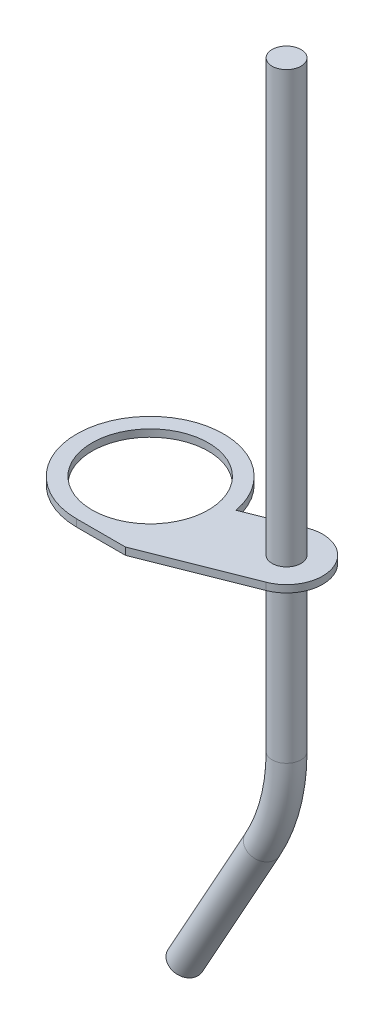
ISO-10303-21;
HEADER;
FILE_DESCRIPTION(('STEP AP214'),'2;1');
FILE_NAME('part.step','',(''),(''),'','','');
FILE_SCHEMA(('AUTOMOTIVE_DESIGN { 1 0 10303 214 1 1 1 1 }'));
ENDSEC;
DATA;
#1=APPLICATION_CONTEXT('core data for automotive mechanical design processes');
#2=APPLICATION_PROTOCOL_DEFINITION('international standard','automotive_design',2000,#1);
#3=PRODUCT_CONTEXT('',#1,'mechanical');
#4=PRODUCT('Part','Part','',(#3));
#5=PRODUCT_RELATED_PRODUCT_CATEGORY('part','',(#4));
#6=PRODUCT_DEFINITION_FORMATION('','',#4);
#7=PRODUCT_DEFINITION_CONTEXT('part definition',#1,'design');
#8=PRODUCT_DEFINITION('design','',#6,#7);
#9=PRODUCT_DEFINITION_SHAPE('','',#8);
#10=(LENGTH_UNIT() NAMED_UNIT(*) SI_UNIT(.MILLI.,.METRE.));
#11=(NAMED_UNIT(*) PLANE_ANGLE_UNIT() SI_UNIT($,.RADIAN.));
#12=(NAMED_UNIT(*) SI_UNIT($,.STERADIAN.) SOLID_ANGLE_UNIT());
#13=UNCERTAINTY_MEASURE_WITH_UNIT(LENGTH_MEASURE(1.E-05),#10,'distance_accuracy_value','');
#14=(GEOMETRIC_REPRESENTATION_CONTEXT(3) GLOBAL_UNCERTAINTY_ASSIGNED_CONTEXT((#13)) GLOBAL_UNIT_ASSIGNED_CONTEXT((#10,
#11,#12)) REPRESENTATION_CONTEXT('',''));
#15=CARTESIAN_POINT('',(0.,0.,0.));
#16=DIRECTION('',(0.,0.,1.));
#17=DIRECTION('',(1.,0.,0.));
#18=AXIS2_PLACEMENT_3D('',#15,#16,#17);
#19=CARTESIAN_POINT('',(0.,0.,0.));
#20=DIRECTION('',(0.,-1.,0.));
#21=DIRECTION('',(0.,0.,-1.));
#22=AXIS2_PLACEMENT_3D('',#19,#20,#21);
#23=CYLINDRICAL_SURFACE('',#22,2.);
#24=CARTESIAN_POINT('',(0.,-83.,0.));
#25=DIRECTION('',(0.,1.,0.));
#26=DIRECTION('',(0.,0.,1.));
#27=AXIS2_PLACEMENT_3D('',#24,#25,#26);
#28=CIRCLE('',#27,2.);
#29=CARTESIAN_POINT('',(1.99999999999992,-83.,0.));
#30=VERTEX_POINT('',#29);
#31=EDGE_CURVE('E150',#30,#30,#28,.T.);
#32=ORIENTED_EDGE('',*,*,#31,.T.);
#33=EDGE_LOOP('',(#32));
#34=FACE_BOUND('',#33,.T.);
#35=CARTESIAN_POINT('',(0.,-60.5,0.));
#36=DIRECTION('',(0.,1.,0.));
#37=DIRECTION('',(0.,0.,1.));
#38=AXIS2_PLACEMENT_3D('',#35,#36,#37);
#39=CIRCLE('',#38,2.);
#40=CARTESIAN_POINT('',(0.,-60.5,2.));
#41=VERTEX_POINT('',#40);
#42=EDGE_CURVE('E11',#41,#41,#39,.T.);
#43=ORIENTED_EDGE('',*,*,#42,.F.);
#44=EDGE_LOOP('',(#43));
#45=FACE_BOUND('',#44,.T.);
#46=ADVANCED_FACE('F39',(#34,#45),#23,.T.);
#47=CARTESIAN_POINT('',(-14.,-115.,0.));
#48=DIRECTION('',(0.485861182519272,0.874035989717228,0.));
#49=DIRECTION('',(0.,0.,1.));
#50=AXIS2_PLACEMENT_3D('',#47,#48,#49);
#51=PLANE('',#50);
#52=CARTESIAN_POINT('',(-14.,-115.,0.));
#53=DIRECTION('',(0.485861182519272,0.874035989717228,0.));
#54=DIRECTION('',(0.,0.,1.));
#55=AXIS2_PLACEMENT_3D('',#52,#53,#54);
#56=CIRCLE('',#55,2.);
#57=CARTESIAN_POINT('',(-12.2519280205655,-115.971722365039,0.));
#58=VERTEX_POINT('',#57);
#59=EDGE_CURVE('E50',#58,#58,#56,.T.);
#60=ORIENTED_EDGE('',*,*,#59,.F.);
#61=EDGE_LOOP('',(#60));
#62=FACE_BOUND('',#61,.T.);
#63=ADVANCED_FACE('F165',(#62),#51,.F.);
#64=CARTESIAN_POINT('',(-26.2857142857141,-83.,0.));
#65=DIRECTION('',(0.,0.,-1.));
#66=DIRECTION('',(-1.,0.,0.));
#67=AXIS2_PLACEMENT_3D('',#64,#65,#66);
#68=TOROIDAL_SURFACE('',#67,26.285714285714,2.);
#69=CARTESIAN_POINT('',(-3.3110539845759,-95.771208226221,0.));
#70=DIRECTION('',(0.485861182519281,0.874035989717223,0.));
#71=DIRECTION('',(0.,0.,1.));
#72=AXIS2_PLACEMENT_3D('',#69,#70,#71);
#73=CIRCLE('',#72,2.);
#74=CARTESIAN_POINT('',(-1.56298200514146,-96.7429305912596,0.));
#75=VERTEX_POINT('',#74);
#76=EDGE_CURVE('E154',#75,#75,#73,.T.);
#77=CARTESIAN_POINT('',(-26.2857142857141,-83.,0.));
#78=DIRECTION('',(0.,0.,-1.));
#79=DIRECTION('',(-1.,0.,0.));
#80=AXIS2_PLACEMENT_3D('',#77,#78,#79);
#81=CIRCLE('',#80,28.285714285714);
#82=EDGE_CURVE('',#30,#75,#81,.T.);
#83=ORIENTED_EDGE('',*,*,#31,.F.);
#84=ORIENTED_EDGE('',*,*,#76,.T.);
#85=ORIENTED_EDGE('',*,*,#82,.T.);
#86=ORIENTED_EDGE('',*,*,#82,.F.);
#87=EDGE_LOOP('',(#83,#85,#84,#86));
#88=FACE_BOUND('',#87,.T.);
#89=ADVANCED_FACE('F167',(#88),#68,.T.);
#90=CARTESIAN_POINT('',(-3.31105398457598,-95.7712082262209,0.));
#91=DIRECTION('',(-0.485861182519272,-0.874035989717228,0.));
#92=DIRECTION('',(0.874035989717228,-0.485861182519272,0.));
#93=AXIS2_PLACEMENT_3D('',#90,#91,#92);
#94=CYLINDRICAL_SURFACE('',#93,2.);
#95=CARTESIAN_POINT('',(-12.2519280205655,-115.971722365039,0.));
#96=CARTESIAN_POINT('',(-12.1405848329048,-115.771422450728,0.));
#97=CARTESIAN_POINT('',(-12.0292416452442,-115.571122536418,0.));
#98=CARTESIAN_POINT('',(-11.8065552699229,-115.170522707798,0.));
#99=CARTESIAN_POINT('',(-11.6952120822622,-114.970222793488,0.));
#100=CARTESIAN_POINT('',(-11.4725257069409,-114.569622964867,0.));
#101=CARTESIAN_POINT('',(-11.3611825192802,-114.369323050557,0.));
#102=CARTESIAN_POINT('',(-11.1384961439589,-113.968723221937,0.));
#103=CARTESIAN_POINT('',(-11.0271529562982,-113.768423307626,0.));
#104=CARTESIAN_POINT('',(-10.8044665809769,-113.367823479006,0.));
#105=CARTESIAN_POINT('',(-10.6931233933162,-113.167523564696,0.));
#106=CARTESIAN_POINT('',(-10.4704370179949,-112.766923736075,0.));
#107=CARTESIAN_POINT('',(-10.3590938303342,-112.566623821765,0.));
#108=CARTESIAN_POINT('',(-10.1364074550129,-112.166023993145,0.));
#109=CARTESIAN_POINT('',(-10.0250642673522,-111.965724078835,0.));
#110=CARTESIAN_POINT('',(-9.80237789203086,-111.565124250214,0.));
#111=CARTESIAN_POINT('',(-9.69103470437019,-111.364824335904,0.));
#112=CARTESIAN_POINT('',(-9.46834832904886,-110.964224507284,0.));
#113=CARTESIAN_POINT('',(-9.35700514138819,-110.763924592973,0.));
#114=CARTESIAN_POINT('',(-9.13431876606686,-110.363324764353,0.));
#115=CARTESIAN_POINT('',(-9.02297557840619,-110.163024850043,0.));
#116=CARTESIAN_POINT('',(-8.80028920308486,-109.762425021422,0.));
#117=CARTESIAN_POINT('',(-8.68894601542419,-109.562125107112,0.));
#118=CARTESIAN_POINT('',(-8.46625964010286,-109.161525278492,0.));
#119=CARTESIAN_POINT('',(-8.35491645244219,-108.961225364182,0.));
#120=CARTESIAN_POINT('',(-8.13223007712086,-108.560625535561,0.));
#121=CARTESIAN_POINT('',(-8.02088688946019,-108.360325621251,0.));
#122=CARTESIAN_POINT('',(-7.79820051413886,-107.959725792631,0.));
#123=CARTESIAN_POINT('',(-7.68685732647819,-107.75942587832,0.));
#124=CARTESIAN_POINT('',(-7.46417095115686,-107.3588260497,0.));
#125=CARTESIAN_POINT('',(-7.35282776349619,-107.15852613539,0.));
#126=CARTESIAN_POINT('',(-7.13014138817486,-106.757926306769,0.));
#127=CARTESIAN_POINT('',(-7.01879820051419,-106.557626392459,0.));
#128=CARTESIAN_POINT('',(-6.79611182519286,-106.157026563839,0.));
#129=CARTESIAN_POINT('',(-6.68476863753219,-105.956726649529,0.));
#130=CARTESIAN_POINT('',(-6.46208226221086,-105.556126820908,0.));
#131=CARTESIAN_POINT('',(-6.35073907455019,-105.355826906598,0.));
#132=CARTESIAN_POINT('',(-6.12805269922886,-104.955227077978,0.));
#133=CARTESIAN_POINT('',(-6.01670951156819,-104.754927163667,0.));
#134=CARTESIAN_POINT('',(-5.79402313624686,-104.354327335047,0.));
#135=CARTESIAN_POINT('',(-5.68267994858619,-104.154027420737,0.));
#136=CARTESIAN_POINT('',(-5.45999357326486,-103.753427592116,0.));
#137=CARTESIAN_POINT('',(-5.34865038560419,-103.553127677806,0.));
#138=CARTESIAN_POINT('',(-5.12596401028286,-103.152527849186,0.));
#139=CARTESIAN_POINT('',(-5.0146208226222,-102.952227934876,0.));
#140=CARTESIAN_POINT('',(-4.79193444730086,-102.551628106255,0.));
#141=CARTESIAN_POINT('',(-4.68059125964019,-102.351328191945,0.));
#142=CARTESIAN_POINT('',(-4.45790488431886,-101.950728363325,0.));
#143=CARTESIAN_POINT('',(-4.3465616966582,-101.750428449014,0.));
#144=CARTESIAN_POINT('',(-4.12387532133686,-101.349828620394,0.));
#145=CARTESIAN_POINT('',(-4.0125321336762,-101.149528706084,0.));
#146=CARTESIAN_POINT('',(-3.78984575835486,-100.748928877463,0.));
#147=CARTESIAN_POINT('',(-3.6785025706942,-100.548628963153,0.));
#148=CARTESIAN_POINT('',(-3.45581619537286,-100.148029134533,0.));
#149=CARTESIAN_POINT('',(-3.3444730077122,-99.9477292202227,0.));
#150=CARTESIAN_POINT('',(-3.12178663239086,-99.5471293916023,0.));
#151=CARTESIAN_POINT('',(-3.0104434447302,-99.3468294772921,0.));
#152=CARTESIAN_POINT('',(-2.78775706940886,-98.9462296486717,0.));
#153=CARTESIAN_POINT('',(-2.6764138817482,-98.7459297343615,0.));
#154=CARTESIAN_POINT('',(-2.45372750642687,-98.3453299057411,0.));
#155=CARTESIAN_POINT('',(-2.3423843187662,-98.1450299914309,0.));
#156=CARTESIAN_POINT('',(-2.11969794344486,-97.7444301628105,0.));
#157=CARTESIAN_POINT('',(-2.0083547557842,-97.5441302485003,0.));
#158=CARTESIAN_POINT('',(-1.78566838046287,-97.1435304198799,0.));
#159=CARTESIAN_POINT('',(-1.6743251928022,-96.9432305055697,0.));
#160=CARTESIAN_POINT('',(-1.56298200514153,-96.7429305912595,0.));
#161=B_SPLINE_CURVE_WITH_KNOTS('',3,(#95,#96,#97,#98,#99,#100,#101,#102,#103,#104,#105,#106,
#107,#108,#109,#110,#111,#112,#113,#114,#115,#116,#117,#118,#119,#120,#121,#122,#123,#124,#125,
#126,#127,#128,#129,#130,#131,#132,#133,#134,#135,#136,#137,#138,#139,#140,#141,#142,#143,#144,
#145,#146,#147,#148,#149,#150,#151,#152,#153,#154,#155,#156,#157,#158,#159,#160),.UNSPECIFIED.,
.F.,.F.,(4,2,2,2,2,2,2,2,2,2,2,2,2,2,2,2,2,2,2,2,2,2,2,2,2,2,2,2,2,2,2,2,4),(0.,0.6875,
1.37500000000001,2.0625,2.75,3.4375,4.125,4.8125,5.5,6.1875,6.875,7.5625,8.25,8.9375,9.625,
10.3125,11.,11.6875,12.375,13.0625,13.75,14.4375,15.125,15.8125,16.5,17.1875,17.875,18.5625,
19.25,19.9375,20.625,21.3125,22.),.UNSPECIFIED.);
#162=EDGE_CURVE('BSEAM162',#58,#75,#161,.T.);
#163=ORIENTED_EDGE('',*,*,#59,.T.);
#164=ORIENTED_EDGE('',*,*,#76,.F.);
#165=ORIENTED_EDGE('',*,*,#162,.T.);
#166=ORIENTED_EDGE('',*,*,#162,.F.);
#167=EDGE_LOOP('',(#163,#165,#164,#166));
#168=FACE_BOUND('',#167,.T.);
#169=ADVANCED_FACE('F162',(#168),#94,.T.);
#170=CARTESIAN_POINT('',(-18.84,-59.5,0.));
#171=DIRECTION('',(0.,-1.,0.));
#172=DIRECTION('',(0.,0.,-1.));
#173=AXIS2_PLACEMENT_3D('',#170,#171,#172);
#174=CYLINDRICAL_SURFACE('',#173,10.16);
#175=CARTESIAN_POINT('',(-18.84,-60.5,0.));
#176=DIRECTION('',(0.,1.,0.));
#177=DIRECTION('',(0.,0.,1.));
#178=AXIS2_PLACEMENT_3D('',#175,#176,#177);
#179=CIRCLE('',#178,10.16);
#180=CARTESIAN_POINT('',(-8.85522732698889,-60.5,-1.87880671392526));
#181=VERTEX_POINT('',#180);
#182=CARTESIAN_POINT('',(-18.84,-60.5,10.16));
#183=VERTEX_POINT('',#182);
#184=EDGE_CURVE('E122',#181,#183,#179,.T.);
#185=ORIENTED_EDGE('',*,*,#184,.T.);
#186=DIRECTION('',(0.,-1.,0.));
#187=VECTOR('',#186,1.);
#188=CARTESIAN_POINT('',(-18.84,-59.5,10.16));
#189=LINE('',#188,#187);
#190=CARTESIAN_POINT('',(-18.84,-59.5,10.16));
#191=VERTEX_POINT('',#190);
#192=EDGE_CURVE('E143',#191,#183,#189,.T.);
#193=ORIENTED_EDGE('',*,*,#192,.F.);
#194=CARTESIAN_POINT('',(-18.84,-59.5,0.));
#195=DIRECTION('',(0.,1.,0.));
#196=DIRECTION('',(0.,0.,1.));
#197=AXIS2_PLACEMENT_3D('',#194,#195,#196);
#198=CIRCLE('',#197,10.16);
#199=CARTESIAN_POINT('',(-8.85522732698889,-59.5,-1.87880671392526));
#200=VERTEX_POINT('',#199);
#201=EDGE_CURVE('E136',#200,#191,#198,.T.);
#202=ORIENTED_EDGE('',*,*,#201,.F.);
#203=DIRECTION('',(0.,-1.,0.));
#204=VECTOR('',#203,1.);
#205=CARTESIAN_POINT('',(-8.85522732698889,-59.5,-1.87880671392526));
#206=LINE('',#205,#204);
#207=EDGE_CURVE('E118',#200,#181,#206,.T.);
#208=ORIENTED_EDGE('',*,*,#207,.T.);
#209=EDGE_LOOP('',(#185,#193,#202,#208));
#210=FACE_BOUND('',#209,.T.);
#211=ADVANCED_FACE('F168',(#210),#174,.T.);
#212=CARTESIAN_POINT('',(-18.84,-59.5,10.16));
#213=DIRECTION('',(0.,0.,-1.));
#214=DIRECTION('',(-1.,0.,0.));
#215=AXIS2_PLACEMENT_3D('',#212,#213,#214);
#216=PLANE('',#215);
#217=DIRECTION('',(1.,0.,0.));
#218=VECTOR('',#217,1.);
#219=CARTESIAN_POINT('',(-18.84,-60.5,10.16));
#220=LINE('',#219,#218);
#221=CARTESIAN_POINT('',(-12.1150484935059,-60.5,10.16));
#222=VERTEX_POINT('',#221);
#223=EDGE_CURVE('E126',#183,#222,#220,.T.);
#224=ORIENTED_EDGE('',*,*,#223,.T.);
#225=DIRECTION('',(0.,-1.,0.));
#226=VECTOR('',#225,1.);
#227=CARTESIAN_POINT('',(-12.1150484935059,-59.5,10.16));
#228=LINE('',#227,#226);
#229=CARTESIAN_POINT('',(-12.1150484935059,-59.5,10.16));
#230=VERTEX_POINT('',#229);
#231=EDGE_CURVE('E111',#230,#222,#228,.T.);
#232=ORIENTED_EDGE('',*,*,#231,.F.);
#233=DIRECTION('',(1.,0.,0.));
#234=VECTOR('',#233,1.);
#235=CARTESIAN_POINT('',(-18.84,-59.5,10.16));
#236=LINE('',#235,#234);
#237=EDGE_CURVE('E93',#191,#230,#236,.T.);
#238=ORIENTED_EDGE('',*,*,#237,.F.);
#239=ORIENTED_EDGE('',*,*,#192,.T.);
#240=EDGE_LOOP('',(#224,#232,#238,#239));
#241=FACE_BOUND('',#240,.T.);
#242=ADVANCED_FACE('F182',(#241),#216,.F.);
#243=CARTESIAN_POINT('',(-12.1150484935059,-59.5,10.16));
#244=DIRECTION('',(-0.367299030129882,0.,-0.930102909610355));
#245=DIRECTION('',(-0.930102909610355,0.,0.367299030129882));
#246=AXIS2_PLACEMENT_3D('',#243,#244,#245);
#247=PLANE('',#246);
#248=DIRECTION('',(0.930102909610355,0.,-0.367299030129882));
#249=VECTOR('',#248,1.);
#250=CARTESIAN_POINT('',(-12.1150484935059,-60.5,10.16));
#251=LINE('',#250,#249);
#252=CARTESIAN_POINT('',(1.83649515064941,-60.5,4.65051454805177));
#253=VERTEX_POINT('',#252);
#254=EDGE_CURVE('E109',#222,#253,#251,.T.);
#255=ORIENTED_EDGE('',*,*,#254,.T.);
#256=DIRECTION('',(0.,-1.,0.));
#257=VECTOR('',#256,1.);
#258=CARTESIAN_POINT('',(1.83649515064941,-59.5,4.65051454805177));
#259=LINE('',#258,#257);
#260=CARTESIAN_POINT('',(1.83649515064941,-59.5,4.65051454805177));
#261=VERTEX_POINT('',#260);
#262=EDGE_CURVE('E106',#261,#253,#259,.T.);
#263=ORIENTED_EDGE('',*,*,#262,.F.);
#264=DIRECTION('',(0.930102909610355,0.,-0.367299030129882));
#265=VECTOR('',#264,1.);
#266=CARTESIAN_POINT('',(-12.1150484935059,-59.5,10.16));
#267=LINE('',#266,#265);
#268=EDGE_CURVE('E97',#230,#261,#267,.T.);
#269=ORIENTED_EDGE('',*,*,#268,.F.);
#270=ORIENTED_EDGE('',*,*,#231,.T.);
#271=EDGE_LOOP('',(#255,#263,#269,#270));
#272=FACE_BOUND('',#271,.T.);
#273=ADVANCED_FACE('F107',(#272),#247,.F.);
#274=CARTESIAN_POINT('',(0.,-59.5,0.));
#275=DIRECTION('',(0.,-1.,0.));
#276=DIRECTION('',(0.,0.,-1.));
#277=AXIS2_PLACEMENT_3D('',#274,#275,#276);
#278=CYLINDRICAL_SURFACE('',#277,5.);
#279=CARTESIAN_POINT('',(0.,-60.5,0.));
#280=DIRECTION('',(0.,1.,0.));
#281=DIRECTION('',(0.,0.,1.));
#282=AXIS2_PLACEMENT_3D('',#279,#280,#281);
#283=CIRCLE('',#282,5.);
#284=CARTESIAN_POINT('',(-1.83649515064941,-60.5,-4.65051454805178));
#285=VERTEX_POINT('',#284);
#286=EDGE_CURVE('E78',#253,#285,#283,.T.);
#287=ORIENTED_EDGE('',*,*,#286,.T.);
#288=DIRECTION('',(0.,-1.,0.));
#289=VECTOR('',#288,1.);
#290=CARTESIAN_POINT('',(-1.83649515064941,-59.5,-4.65051454805178));
#291=LINE('',#290,#289);
#292=CARTESIAN_POINT('',(-1.83649515064941,-59.5,-4.65051454805178));
#293=VERTEX_POINT('',#292);
#294=EDGE_CURVE('E112',#293,#285,#291,.T.);
#295=ORIENTED_EDGE('',*,*,#294,.F.);
#296=CARTESIAN_POINT('',(0.,-59.5,0.));
#297=DIRECTION('',(0.,1.,0.));
#298=DIRECTION('',(0.,0.,1.));
#299=AXIS2_PLACEMENT_3D('',#296,#297,#298);
#300=CIRCLE('',#299,5.);
#301=EDGE_CURVE('E101',#261,#293,#300,.T.);
#302=ORIENTED_EDGE('',*,*,#301,.F.);
#303=ORIENTED_EDGE('',*,*,#262,.T.);
#304=EDGE_LOOP('',(#287,#295,#302,#303));
#305=FACE_BOUND('',#304,.T.);
#306=ADVANCED_FACE('F114',(#305),#278,.T.);
#307=CARTESIAN_POINT('',(-1.83649515064941,-59.5,-4.65051454805178));
#308=DIRECTION('',(0.367299030129882,0.,0.930102909610355));
#309=DIRECTION('',(0.930102909610355,0.,-0.367299030129882));
#310=AXIS2_PLACEMENT_3D('',#307,#308,#309);
#311=PLANE('',#310);
#312=DIRECTION('',(-0.930102909610355,0.,0.367299030129882));
#313=VECTOR('',#312,1.);
#314=CARTESIAN_POINT('',(-1.83649515064941,-60.5,-4.65051454805178));
#315=LINE('',#314,#313);
#316=EDGE_CURVE('E84',#285,#181,#315,.T.);
#317=ORIENTED_EDGE('',*,*,#316,.T.);
#318=ORIENTED_EDGE('',*,*,#207,.F.);
#319=DIRECTION('',(-0.930102909610355,0.,0.367299030129882));
#320=VECTOR('',#319,1.);
#321=CARTESIAN_POINT('',(-1.83649515064941,-59.5,-4.65051454805178));
#322=LINE('',#321,#320);
#323=EDGE_CURVE('E58',#293,#200,#322,.T.);
#324=ORIENTED_EDGE('',*,*,#323,.F.);
#325=ORIENTED_EDGE('',*,*,#294,.T.);
#326=EDGE_LOOP('',(#317,#318,#324,#325));
#327=FACE_BOUND('',#326,.T.);
#328=ADVANCED_FACE('F210',(#327),#311,.F.);
#329=CARTESIAN_POINT('',(-18.84,-59.5,0.));
#330=DIRECTION('',(0.,1.,0.));
#331=DIRECTION('',(0.,0.,1.));
#332=AXIS2_PLACEMENT_3D('',#329,#330,#331);
#333=PLANE('',#332);
#334=CARTESIAN_POINT('',(-18.84,-59.5,0.));
#335=DIRECTION('',(0.,1.,0.));
#336=DIRECTION('',(0.,0.,1.));
#337=AXIS2_PLACEMENT_3D('',#334,#335,#336);
#338=CIRCLE('',#337,8.04);
#339=CARTESIAN_POINT('',(-18.84,-59.5,8.04));
#340=VERTEX_POINT('',#339);
#341=EDGE_CURVE('E298',#340,#340,#338,.T.);
#342=ORIENTED_EDGE('',*,*,#341,.F.);
#343=EDGE_LOOP('',(#342));
#344=FACE_BOUND('',#343,.T.);
#345=CARTESIAN_POINT('',(0.,-59.5,0.));
#346=DIRECTION('',(0.,1.,0.));
#347=DIRECTION('',(0.,0.,1.));
#348=AXIS2_PLACEMENT_3D('',#345,#346,#347);
#349=CIRCLE('',#348,2.);
#350=CARTESIAN_POINT('',(0.,-59.5,2.));
#351=VERTEX_POINT('',#350);
#352=EDGE_CURVE('E43',#351,#351,#349,.T.);
#353=ORIENTED_EDGE('',*,*,#352,.F.);
#354=EDGE_LOOP('',(#353));
#355=FACE_BOUND('',#354,.T.);
#356=ORIENTED_EDGE('',*,*,#201,.T.);
#357=ORIENTED_EDGE('',*,*,#237,.T.);
#358=ORIENTED_EDGE('',*,*,#268,.T.);
#359=ORIENTED_EDGE('',*,*,#301,.T.);
#360=ORIENTED_EDGE('',*,*,#323,.T.);
#361=EDGE_LOOP('',(#356,#357,#358,#359,#360));
#362=FACE_BOUND('',#361,.T.);
#363=ADVANCED_FACE('F99',(#344,#355,#362),#333,.T.);
#364=CARTESIAN_POINT('',(-18.84,-60.5,0.));
#365=DIRECTION('',(0.,1.,0.));
#366=DIRECTION('',(0.,0.,1.));
#367=AXIS2_PLACEMENT_3D('',#364,#365,#366);
#368=PLANE('',#367);
#369=CARTESIAN_POINT('',(-18.84,-60.5,0.));
#370=DIRECTION('',(0.,1.,0.));
#371=DIRECTION('',(0.,0.,1.));
#372=AXIS2_PLACEMENT_3D('',#369,#370,#371);
#373=CIRCLE('',#372,8.04);
#374=CARTESIAN_POINT('',(-18.84,-60.5,8.04));
#375=VERTEX_POINT('',#374);
#376=EDGE_CURVE('E127',#375,#375,#373,.F.);
#377=ORIENTED_EDGE('',*,*,#376,.F.);
#378=EDGE_LOOP('',(#377));
#379=FACE_BOUND('',#378,.T.);
#380=ORIENTED_EDGE('',*,*,#42,.T.);
#381=EDGE_LOOP('',(#380));
#382=FACE_BOUND('',#381,.T.);
#383=ORIENTED_EDGE('',*,*,#184,.F.);
#384=ORIENTED_EDGE('',*,*,#316,.F.);
#385=ORIENTED_EDGE('',*,*,#286,.F.);
#386=ORIENTED_EDGE('',*,*,#254,.F.);
#387=ORIENTED_EDGE('',*,*,#223,.F.);
#388=EDGE_LOOP('',(#383,#384,#385,#386,#387));
#389=FACE_BOUND('',#388,.T.);
#390=ADVANCED_FACE('F201',(#379,#382,#389),#368,.F.);
#391=CARTESIAN_POINT('',(0.,0.,0.));
#392=DIRECTION('',(0.,1.,0.));
#393=DIRECTION('',(0.,0.,1.));
#394=AXIS2_PLACEMENT_3D('',#391,#392,#393);
#395=PLANE('',#394);
#396=CARTESIAN_POINT('',(0.,0.,0.));
#397=DIRECTION('',(0.,1.,0.));
#398=DIRECTION('',(0.,0.,1.));
#399=AXIS2_PLACEMENT_3D('',#396,#397,#398);
#400=CIRCLE('',#399,2.);
#401=CARTESIAN_POINT('',(0.,0.,2.));
#402=VERTEX_POINT('',#401);
#403=EDGE_CURVE('E146',#402,#402,#400,.T.);
#404=ORIENTED_EDGE('',*,*,#403,.T.);
#405=EDGE_LOOP('',(#404));
#406=FACE_BOUND('',#405,.T.);
#407=ADVANCED_FACE('F41',(#406),#395,.T.);
#408=ORIENTED_EDGE('',*,*,#352,.T.);
#409=EDGE_LOOP('',(#408));
#410=FACE_BOUND('',#409,.T.);
#411=ORIENTED_EDGE('',*,*,#403,.F.);
#412=EDGE_LOOP('',(#411));
#413=FACE_BOUND('',#412,.T.);
#414=ADVANCED_FACE('F179',(#410,#413),#23,.T.);
#415=CARTESIAN_POINT('',(-18.84,-115.972722365039,0.));
#416=DIRECTION('',(0.,1.,0.));
#417=DIRECTION('',(0.,0.,1.));
#418=AXIS2_PLACEMENT_3D('',#415,#416,#417);
#419=CYLINDRICAL_SURFACE('',#418,8.04);
#420=CARTESIAN_POINT('',(-18.84,-59.5,8.04));
#421=CARTESIAN_POINT('',(-18.84,-59.5104166666667,8.04));
#422=CARTESIAN_POINT('',(-18.84,-59.5208333333333,8.04));
#423=CARTESIAN_POINT('',(-18.84,-59.5416666666667,8.04));
#424=CARTESIAN_POINT('',(-18.84,-59.5520833333333,8.04));
#425=CARTESIAN_POINT('',(-18.84,-59.5729166666667,8.04));
#426=CARTESIAN_POINT('',(-18.84,-59.5833333333333,8.04));
#427=CARTESIAN_POINT('',(-18.84,-59.6041666666667,8.04));
#428=CARTESIAN_POINT('',(-18.84,-59.6145833333333,8.04));
#429=CARTESIAN_POINT('',(-18.84,-59.6354166666667,8.04));
#430=CARTESIAN_POINT('',(-18.84,-59.6458333333333,8.04));
#431=CARTESIAN_POINT('',(-18.84,-59.6666666666667,8.04));
#432=CARTESIAN_POINT('',(-18.84,-59.6770833333333,8.04));
#433=CARTESIAN_POINT('',(-18.84,-59.6979166666667,8.04));
#434=CARTESIAN_POINT('',(-18.84,-59.7083333333333,8.04));
#435=CARTESIAN_POINT('',(-18.84,-59.7291666666667,8.04));
#436=CARTESIAN_POINT('',(-18.84,-59.7395833333333,8.04));
#437=CARTESIAN_POINT('',(-18.84,-59.7604166666667,8.04));
#438=CARTESIAN_POINT('',(-18.84,-59.7708333333333,8.04));
#439=CARTESIAN_POINT('',(-18.84,-59.7916666666667,8.04));
#440=CARTESIAN_POINT('',(-18.84,-59.8020833333333,8.04));
#441=CARTESIAN_POINT('',(-18.84,-59.8229166666667,8.04));
#442=CARTESIAN_POINT('',(-18.84,-59.8333333333333,8.04));
#443=CARTESIAN_POINT('',(-18.84,-59.8541666666667,8.04));
#444=CARTESIAN_POINT('',(-18.84,-59.8645833333333,8.04));
#445=CARTESIAN_POINT('',(-18.84,-59.8854166666667,8.04));
#446=CARTESIAN_POINT('',(-18.84,-59.8958333333333,8.04));
#447=CARTESIAN_POINT('',(-18.84,-59.9166666666667,8.04));
#448=CARTESIAN_POINT('',(-18.84,-59.9270833333333,8.04));
#449=CARTESIAN_POINT('',(-18.84,-59.9479166666667,8.04));
#450=CARTESIAN_POINT('',(-18.84,-59.9583333333333,8.04));
#451=CARTESIAN_POINT('',(-18.84,-59.9791666666667,8.04));
#452=CARTESIAN_POINT('',(-18.84,-59.9895833333333,8.04));
#453=CARTESIAN_POINT('',(-18.84,-60.0104166666667,8.04));
#454=CARTESIAN_POINT('',(-18.84,-60.0208333333333,8.04));
#455=CARTESIAN_POINT('',(-18.84,-60.0416666666667,8.04));
#456=CARTESIAN_POINT('',(-18.84,-60.0520833333333,8.04));
#457=CARTESIAN_POINT('',(-18.84,-60.0729166666667,8.04));
#458=CARTESIAN_POINT('',(-18.84,-60.0833333333333,8.04));
#459=CARTESIAN_POINT('',(-18.84,-60.1041666666667,8.04));
#460=CARTESIAN_POINT('',(-18.84,-60.1145833333333,8.04));
#461=CARTESIAN_POINT('',(-18.84,-60.1354166666667,8.04));
#462=CARTESIAN_POINT('',(-18.84,-60.1458333333333,8.04));
#463=CARTESIAN_POINT('',(-18.84,-60.1666666666667,8.04));
#464=CARTESIAN_POINT('',(-18.84,-60.1770833333333,8.04));
#465=CARTESIAN_POINT('',(-18.84,-60.1979166666667,8.04));
#466=CARTESIAN_POINT('',(-18.84,-60.2083333333333,8.04));
#467=CARTESIAN_POINT('',(-18.84,-60.2291666666667,8.04));
#468=CARTESIAN_POINT('',(-18.84,-60.2395833333333,8.04));
#469=CARTESIAN_POINT('',(-18.84,-60.2604166666667,8.04));
#470=CARTESIAN_POINT('',(-18.84,-60.2708333333333,8.04));
#471=CARTESIAN_POINT('',(-18.84,-60.2916666666667,8.04));
#472=CARTESIAN_POINT('',(-18.84,-60.3020833333333,8.04));
#473=CARTESIAN_POINT('',(-18.84,-60.3229166666667,8.04));
#474=CARTESIAN_POINT('',(-18.84,-60.3333333333333,8.04));
#475=CARTESIAN_POINT('',(-18.84,-60.3541666666667,8.04));
#476=CARTESIAN_POINT('',(-18.84,-60.3645833333333,8.04));
#477=CARTESIAN_POINT('',(-18.84,-60.3854166666667,8.04));
#478=CARTESIAN_POINT('',(-18.84,-60.3958333333333,8.04));
#479=CARTESIAN_POINT('',(-18.84,-60.4166666666667,8.04));
#480=CARTESIAN_POINT('',(-18.84,-60.4270833333333,8.04));
#481=CARTESIAN_POINT('',(-18.84,-60.4479166666667,8.04));
#482=CARTESIAN_POINT('',(-18.84,-60.4583333333333,8.04));
#483=CARTESIAN_POINT('',(-18.84,-60.4791666666667,8.04));
#484=CARTESIAN_POINT('',(-18.84,-60.4895833333333,8.04));
#485=CARTESIAN_POINT('',(-18.84,-60.5,8.04));
#486=B_SPLINE_CURVE_WITH_KNOTS('',3,(#420,#421,#422,#423,#424,#425,#426,#427,#428,#429,#430,
#431,#432,#433,#434,#435,#436,#437,#438,#439,#440,#441,#442,#443,#444,#445,#446,#447,#448,#449,
#450,#451,#452,#453,#454,#455,#456,#457,#458,#459,#460,#461,#462,#463,#464,#465,#466,#467,#468,
#469,#470,#471,#472,#473,#474,#475,#476,#477,#478,#479,#480,#481,#482,#483,#484,#485),
.UNSPECIFIED.,.F.,.F.,(4,2,2,2,2,2,2,2,2,2,2,2,2,2,2,2,2,2,2,2,2,2,2,2,2,2,2,2,2,2,2,2,4),(0.,
0.0312499999999966,0.0625000000000001,0.0937500000000036,0.125,0.156249999999997,0.1875,
0.218750000000004,0.25,0.281249999999997,0.3125,0.343750000000004,0.375,0.406249999999997,
0.4375,0.468750000000004,0.5,0.531249999999997,0.5625,0.593750000000004,0.625000000000001,
0.656249999999997,0.687500000000001,0.718750000000004,0.750000000000001,0.781249999999997,
0.812500000000001,0.843750000000004,0.875000000000001,0.906249999999997,0.937500000000001,
0.968750000000004,1.),.UNSPECIFIED.);
#487=EDGE_CURVE('BSEAM193',#340,#375,#486,.T.);
#488=ORIENTED_EDGE('',*,*,#341,.T.);
#489=ORIENTED_EDGE('',*,*,#376,.T.);
#490=ORIENTED_EDGE('',*,*,#487,.T.);
#491=ORIENTED_EDGE('',*,*,#487,.F.);
#492=EDGE_LOOP('',(#488,#490,#489,#491));
#493=FACE_BOUND('',#492,.T.);
#494=ADVANCED_FACE('F193',(#493),#419,.F.);
#495=CLOSED_SHELL('',(#46,#63,#89,#169,#211,#242,#273,#306,#328,#363,#390,#407,#414,#494));
#496=MANIFOLD_SOLID_BREP('B2',#495);
#497=ADVANCED_BREP_SHAPE_REPRESENTATION('',(#18,#496),#14);
#498=SHAPE_DEFINITION_REPRESENTATION(#9,#497);
ENDSEC;
END-ISO-10303-21;
